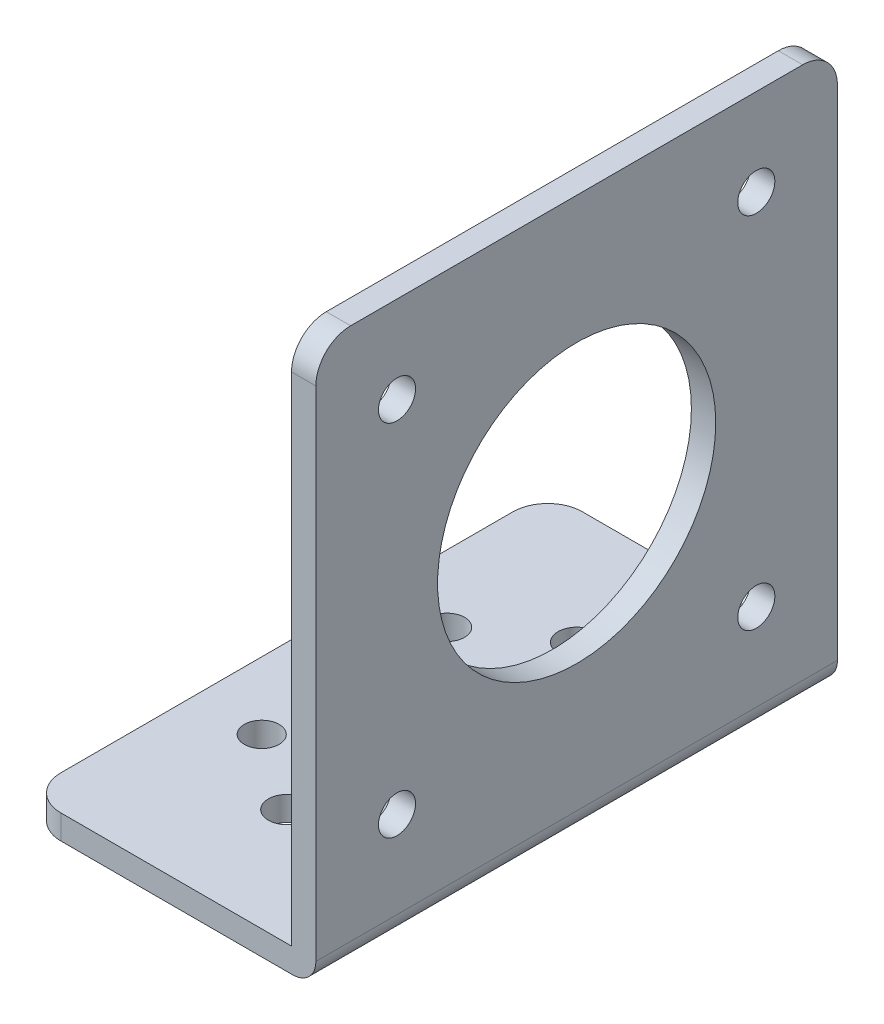
ISO-10303-21;
HEADER;
FILE_DESCRIPTION(('STEP AP214'),'2;1');
FILE_NAME('part.step','',(''),(''),'','','');
FILE_SCHEMA(('AUTOMOTIVE_DESIGN { 1 0 10303 214 1 1 1 1 }'));
ENDSEC;
DATA;
#1=APPLICATION_CONTEXT('core data for automotive mechanical design processes');
#2=APPLICATION_PROTOCOL_DEFINITION('international standard','automotive_design',2000,#1);
#3=PRODUCT_CONTEXT('',#1,'mechanical');
#4=PRODUCT('Part','Part','',(#3));
#5=PRODUCT_RELATED_PRODUCT_CATEGORY('part','',(#4));
#6=PRODUCT_DEFINITION_FORMATION('','',#4);
#7=PRODUCT_DEFINITION_CONTEXT('part definition',#1,'design');
#8=PRODUCT_DEFINITION('design','',#6,#7);
#9=PRODUCT_DEFINITION_SHAPE('','',#8);
#10=(LENGTH_UNIT() NAMED_UNIT(*) SI_UNIT(.MILLI.,.METRE.));
#11=(NAMED_UNIT(*) PLANE_ANGLE_UNIT() SI_UNIT($,.RADIAN.));
#12=(NAMED_UNIT(*) SI_UNIT($,.STERADIAN.) SOLID_ANGLE_UNIT());
#13=UNCERTAINTY_MEASURE_WITH_UNIT(LENGTH_MEASURE(1.E-05),#10,'distance_accuracy_value','');
#14=(GEOMETRIC_REPRESENTATION_CONTEXT(3) GLOBAL_UNCERTAINTY_ASSIGNED_CONTEXT((#13)) GLOBAL_UNIT_ASSIGNED_CONTEXT((#10,
#11,#12)) REPRESENTATION_CONTEXT('',''));
#15=CARTESIAN_POINT('',(0.,0.,0.));
#16=DIRECTION('',(0.,0.,1.));
#17=DIRECTION('',(1.,0.,0.));
#18=AXIS2_PLACEMENT_3D('',#15,#16,#17);
#19=CARTESIAN_POINT('',(0.,2.1,22.5));
#20=DIRECTION('',(0.,-1.,0.));
#21=DIRECTION('',(0.,0.,-1.));
#22=AXIS2_PLACEMENT_3D('',#19,#20,#21);
#23=PLANE('',#22);
#24=CARTESIAN_POINT('',(-2.10285259006358,2.1,7.96899861443036));
#25=DIRECTION('',(0.,1.,0.));
#26=DIRECTION('',(0.,0.,1.));
#27=AXIS2_PLACEMENT_3D('',#24,#25,#26);
#28=CIRCLE('',#27,1.49999999999999);
#29=CARTESIAN_POINT('',(-2.10285259006358,2.1,9.46899861443035));
#30=VERTEX_POINT('',#29);
#31=EDGE_CURVE('E504',#30,#30,#28,.T.);
#32=ORIENTED_EDGE('',*,*,#31,.F.);
#33=EDGE_LOOP('',(#32));
#34=FACE_BOUND('',#33,.T.);
#35=CARTESIAN_POINT('',(-17.1028525900636,2.1,-8.03100138556964));
#36=DIRECTION('',(0.,1.,0.));
#37=DIRECTION('',(0.,0.,1.));
#38=AXIS2_PLACEMENT_3D('',#35,#36,#37);
#39=CIRCLE('',#38,1.49999999999999);
#40=CARTESIAN_POINT('',(-17.1028525900636,2.1,-6.53100138556965));
#41=VERTEX_POINT('',#40);
#42=EDGE_CURVE('E496',#41,#41,#39,.T.);
#43=ORIENTED_EDGE('',*,*,#42,.F.);
#44=EDGE_LOOP('',(#43));
#45=FACE_BOUND('',#44,.T.);
#46=CARTESIAN_POINT('',(-17.1028525900636,2.1,7.96899861443036));
#47=DIRECTION('',(0.,1.,0.));
#48=DIRECTION('',(0.,0.,1.));
#49=AXIS2_PLACEMENT_3D('',#46,#47,#48);
#50=CIRCLE('',#49,1.49999999999999);
#51=CARTESIAN_POINT('',(-17.1028525900636,2.1,9.46899861443035));
#52=VERTEX_POINT('',#51);
#53=EDGE_CURVE('E488',#52,#52,#50,.T.);
#54=ORIENTED_EDGE('',*,*,#53,.F.);
#55=EDGE_LOOP('',(#54));
#56=FACE_BOUND('',#55,.T.);
#57=CARTESIAN_POINT('',(-2.10285259006358,2.1,-8.03100138556964));
#58=DIRECTION('',(0.,1.,0.));
#59=DIRECTION('',(0.,0.,1.));
#60=AXIS2_PLACEMENT_3D('',#57,#58,#59);
#61=CIRCLE('',#60,1.49999999999999);
#62=CARTESIAN_POINT('',(-2.10285259006358,2.1,-6.53100138556965));
#63=VERTEX_POINT('',#62);
#64=EDGE_CURVE('E480',#63,#63,#61,.T.);
#65=ORIENTED_EDGE('',*,*,#64,.F.);
#66=EDGE_LOOP('',(#65));
#67=FACE_BOUND('',#66,.T.);
#68=CARTESIAN_POINT('',(-10.4,2.1,-12.5));
#69=DIRECTION('',(0.,1.,0.));
#70=DIRECTION('',(0.,0.,1.));
#71=AXIS2_PLACEMENT_3D('',#68,#69,#70);
#72=CIRCLE('',#71,1.59999999999999);
#73=CARTESIAN_POINT('',(-10.4,2.1,-10.9));
#74=VERTEX_POINT('',#73);
#75=EDGE_CURVE('E472',#74,#74,#72,.T.);
#76=ORIENTED_EDGE('',*,*,#75,.F.);
#77=EDGE_LOOP('',(#76));
#78=FACE_BOUND('',#77,.T.);
#79=DIRECTION('',(0.,0.,-1.));
#80=VECTOR('',#79,1.);
#81=CARTESIAN_POINT('',(-22.9,2.1,22.5));
#82=LINE('',#81,#80);
#83=CARTESIAN_POINT('',(-22.9,2.1,19.5));
#84=VERTEX_POINT('',#83);
#85=CARTESIAN_POINT('',(-22.9,2.1,-19.5));
#86=VERTEX_POINT('',#85);
#87=EDGE_CURVE('E155',#84,#86,#82,.T.);
#88=ORIENTED_EDGE('',*,*,#87,.F.);
#89=CARTESIAN_POINT('',(-19.9,2.1,19.5));
#90=DIRECTION('',(0.,-1.,0.));
#91=DIRECTION('',(0.,0.,-1.));
#92=AXIS2_PLACEMENT_3D('',#89,#90,#91);
#93=CIRCLE('',#92,3.);
#94=CARTESIAN_POINT('',(-19.9,2.1,22.5));
#95=VERTEX_POINT('',#94);
#96=EDGE_CURVE('E161',#84,#95,#93,.F.);
#97=ORIENTED_EDGE('',*,*,#96,.T.);
#98=DIRECTION('',(-1.,0.,0.));
#99=VECTOR('',#98,1.);
#100=CARTESIAN_POINT('',(0.,2.1,22.5));
#101=LINE('',#100,#99);
#102=CARTESIAN_POINT('',(0.,2.1,22.5));
#103=VERTEX_POINT('',#102);
#104=EDGE_CURVE('E137',#103,#95,#101,.T.);
#105=ORIENTED_EDGE('',*,*,#104,.F.);
#106=DIRECTION('',(0.,0.,-1.));
#107=VECTOR('',#106,1.);
#108=CARTESIAN_POINT('',(0.,2.1,22.5));
#109=LINE('',#108,#107);
#110=CARTESIAN_POINT('',(0.,2.1,-22.5));
#111=VERTEX_POINT('',#110);
#112=EDGE_CURVE('E147',#103,#111,#109,.T.);
#113=ORIENTED_EDGE('',*,*,#112,.T.);
#114=DIRECTION('',(-1.,0.,0.));
#115=VECTOR('',#114,1.);
#116=CARTESIAN_POINT('',(0.,2.1,-22.5));
#117=LINE('',#116,#115);
#118=CARTESIAN_POINT('',(-19.9,2.1,-22.5));
#119=VERTEX_POINT('',#118);
#120=EDGE_CURVE('E144',#111,#119,#117,.T.);
#121=ORIENTED_EDGE('',*,*,#120,.T.);
#122=CARTESIAN_POINT('',(-19.9,2.1,-19.5));
#123=DIRECTION('',(0.,-1.,0.));
#124=DIRECTION('',(0.,0.,-1.));
#125=AXIS2_PLACEMENT_3D('',#122,#123,#124);
#126=CIRCLE('',#125,3.);
#127=EDGE_CURVE('E246',#119,#86,#126,.F.);
#128=ORIENTED_EDGE('',*,*,#127,.T.);
#129=EDGE_LOOP('',(#88,#97,#105,#113,#121,#128));
#130=FACE_BOUND('',#129,.T.);
#131=CARTESIAN_POINT('',(-10.4,2.1,12.5));
#132=DIRECTION('',(0.,1.,0.));
#133=DIRECTION('',(0.,0.,1.));
#134=AXIS2_PLACEMENT_3D('',#131,#132,#133);
#135=CIRCLE('',#134,1.59999999999999);
#136=CARTESIAN_POINT('',(-10.4,2.1,14.1));
#137=VERTEX_POINT('',#136);
#138=EDGE_CURVE('E464',#137,#137,#135,.T.);
#139=ORIENTED_EDGE('',*,*,#138,.F.);
#140=EDGE_LOOP('',(#139));
#141=FACE_BOUND('',#140,.T.);
#142=ADVANCED_FACE('F47',(#34,#45,#56,#67,#78,#130,#141),#23,.F.);
#143=CARTESIAN_POINT('',(-22.9,0.,-22.5));
#144=DIRECTION('',(0.,0.,-1.));
#145=DIRECTION('',(-1.,0.,0.));
#146=AXIS2_PLACEMENT_3D('',#143,#144,#145);
#147=PLANE('',#146);
#148=DIRECTION('',(1.,0.,0.));
#149=VECTOR('',#148,1.);
#150=CARTESIAN_POINT('',(-22.9,0.,-22.5));
#151=LINE('',#150,#149);
#152=CARTESIAN_POINT('',(-19.9,0.,-22.5));
#153=VERTEX_POINT('',#152);
#154=CARTESIAN_POINT('',(0.0999999999999994,0.,-22.5));
#155=VERTEX_POINT('',#154);
#156=EDGE_CURVE('E191',#153,#155,#151,.T.);
#157=ORIENTED_EDGE('',*,*,#156,.F.);
#158=DIRECTION('',(0.,1.,0.));
#159=VECTOR('',#158,1.);
#160=CARTESIAN_POINT('',(-19.9,2.1,-22.5));
#161=LINE('',#160,#159);
#162=EDGE_CURVE('E255',#153,#119,#161,.T.);
#163=ORIENTED_EDGE('',*,*,#162,.T.);
#164=ORIENTED_EDGE('',*,*,#120,.F.);
#165=DIRECTION('',(0.,-1.,0.));
#166=VECTOR('',#165,1.);
#167=CARTESIAN_POINT('',(0.,48.,-22.5));
#168=LINE('',#167,#166);
#169=CARTESIAN_POINT('',(0.,45.,-22.5));
#170=VERTEX_POINT('',#169);
#171=EDGE_CURVE('E150',#170,#111,#168,.T.);
#172=ORIENTED_EDGE('',*,*,#171,.F.);
#173=DIRECTION('',(1.,0.,0.));
#174=VECTOR('',#173,1.);
#175=CARTESIAN_POINT('',(-22.9,45.,-22.5));
#176=LINE('',#175,#174);
#177=CARTESIAN_POINT('',(2.1,45.,-22.5));
#178=VERTEX_POINT('',#177);
#179=EDGE_CURVE('E251',#170,#178,#176,.T.);
#180=ORIENTED_EDGE('',*,*,#179,.T.);
#181=DIRECTION('',(0.,1.,0.));
#182=VECTOR('',#181,1.);
#183=CARTESIAN_POINT('',(2.1,0.,-22.5));
#184=LINE('',#183,#182);
#185=CARTESIAN_POINT('',(2.1,2.,-22.5));
#186=VERTEX_POINT('',#185);
#187=EDGE_CURVE('E176',#186,#178,#184,.T.);
#188=ORIENTED_EDGE('',*,*,#187,.F.);
#189=CARTESIAN_POINT('',(0.0999999999999998,2.,-22.5));
#190=DIRECTION('',(0.,0.,-1.));
#191=DIRECTION('',(-1.,0.,0.));
#192=AXIS2_PLACEMENT_3D('',#189,#190,#191);
#193=CIRCLE('',#192,2.);
#194=EDGE_CURVE('E217',#186,#155,#193,.T.);
#195=ORIENTED_EDGE('',*,*,#194,.T.);
#196=EDGE_LOOP('',(#157,#163,#164,#172,#180,#188,#195));
#197=FACE_BOUND('',#196,.T.);
#198=ADVANCED_FACE('F276',(#197),#147,.T.);
#199=CARTESIAN_POINT('',(-22.9,0.,22.5));
#200=DIRECTION('',(0.,-1.,0.));
#201=DIRECTION('',(0.,0.,-1.));
#202=AXIS2_PLACEMENT_3D('',#199,#200,#201);
#203=PLANE('',#202);
#204=CARTESIAN_POINT('',(-2.10285259006358,0.,7.96899861443036));
#205=DIRECTION('',(0.,1.,0.));
#206=DIRECTION('',(0.,0.,1.));
#207=AXIS2_PLACEMENT_3D('',#204,#205,#206);
#208=CIRCLE('',#207,1.5);
#209=CARTESIAN_POINT('',(-2.10285259006358,0.,9.46899861443036));
#210=VERTEX_POINT('',#209);
#211=EDGE_CURVE('E500',#210,#210,#208,.T.);
#212=ORIENTED_EDGE('',*,*,#211,.T.);
#213=EDGE_LOOP('',(#212));
#214=FACE_BOUND('',#213,.T.);
#215=CARTESIAN_POINT('',(-17.1028525900636,0.,-8.03100138556964));
#216=DIRECTION('',(0.,1.,0.));
#217=DIRECTION('',(0.,0.,1.));
#218=AXIS2_PLACEMENT_3D('',#215,#216,#217);
#219=CIRCLE('',#218,1.5);
#220=CARTESIAN_POINT('',(-17.1028525900636,0.,-6.53100138556964));
#221=VERTEX_POINT('',#220);
#222=EDGE_CURVE('E492',#221,#221,#219,.T.);
#223=ORIENTED_EDGE('',*,*,#222,.T.);
#224=EDGE_LOOP('',(#223));
#225=FACE_BOUND('',#224,.T.);
#226=CARTESIAN_POINT('',(-17.1028525900636,0.,7.96899861443036));
#227=DIRECTION('',(0.,1.,0.));
#228=DIRECTION('',(0.,0.,1.));
#229=AXIS2_PLACEMENT_3D('',#226,#227,#228);
#230=CIRCLE('',#229,1.5);
#231=CARTESIAN_POINT('',(-17.1028525900636,0.,9.46899861443036));
#232=VERTEX_POINT('',#231);
#233=EDGE_CURVE('E484',#232,#232,#230,.T.);
#234=ORIENTED_EDGE('',*,*,#233,.T.);
#235=EDGE_LOOP('',(#234));
#236=FACE_BOUND('',#235,.T.);
#237=CARTESIAN_POINT('',(-2.10285259006358,0.,-8.03100138556964));
#238=DIRECTION('',(0.,1.,0.));
#239=DIRECTION('',(0.,0.,1.));
#240=AXIS2_PLACEMENT_3D('',#237,#238,#239);
#241=CIRCLE('',#240,1.5);
#242=CARTESIAN_POINT('',(-2.10285259006358,0.,-6.53100138556964));
#243=VERTEX_POINT('',#242);
#244=EDGE_CURVE('E476',#243,#243,#241,.T.);
#245=ORIENTED_EDGE('',*,*,#244,.T.);
#246=EDGE_LOOP('',(#245));
#247=FACE_BOUND('',#246,.T.);
#248=CARTESIAN_POINT('',(-10.4,0.,-12.5));
#249=DIRECTION('',(0.,1.,0.));
#250=DIRECTION('',(0.,0.,1.));
#251=AXIS2_PLACEMENT_3D('',#248,#249,#250);
#252=CIRCLE('',#251,1.59999999999999);
#253=CARTESIAN_POINT('',(-10.4,0.,-10.9));
#254=VERTEX_POINT('',#253);
#255=EDGE_CURVE('E468',#254,#254,#252,.T.);
#256=ORIENTED_EDGE('',*,*,#255,.T.);
#257=EDGE_LOOP('',(#256));
#258=FACE_BOUND('',#257,.T.);
#259=CARTESIAN_POINT('',(-10.4,0.,12.5));
#260=DIRECTION('',(0.,1.,0.));
#261=DIRECTION('',(0.,0.,1.));
#262=AXIS2_PLACEMENT_3D('',#259,#260,#261);
#263=CIRCLE('',#262,1.59999999999999);
#264=CARTESIAN_POINT('',(-10.4,0.,14.1));
#265=VERTEX_POINT('',#264);
#266=EDGE_CURVE('E460',#265,#265,#263,.T.);
#267=ORIENTED_EDGE('',*,*,#266,.T.);
#268=EDGE_LOOP('',(#267));
#269=FACE_BOUND('',#268,.T.);
#270=DIRECTION('',(1.,0.,0.));
#271=VECTOR('',#270,1.);
#272=CARTESIAN_POINT('',(-22.9,0.,22.5));
#273=LINE('',#272,#271);
#274=CARTESIAN_POINT('',(-19.9,0.,22.5));
#275=VERTEX_POINT('',#274);
#276=CARTESIAN_POINT('',(0.0999999999999994,0.,22.5));
#277=VERTEX_POINT('',#276);
#278=EDGE_CURVE('E182',#275,#277,#273,.T.);
#279=ORIENTED_EDGE('',*,*,#278,.F.);
#280=CARTESIAN_POINT('',(-19.9,0.,19.5));
#281=DIRECTION('',(0.,-1.,0.));
#282=DIRECTION('',(0.,0.,-1.));
#283=AXIS2_PLACEMENT_3D('',#280,#281,#282);
#284=CIRCLE('',#283,3.);
#285=CARTESIAN_POINT('',(-22.9,0.,19.5));
#286=VERTEX_POINT('',#285);
#287=EDGE_CURVE('E237',#275,#286,#284,.T.);
#288=ORIENTED_EDGE('',*,*,#287,.T.);
#289=DIRECTION('',(0.,0.,-1.));
#290=VECTOR('',#289,1.);
#291=CARTESIAN_POINT('',(-22.9,0.,22.5));
#292=LINE('',#291,#290);
#293=CARTESIAN_POINT('',(-22.9,0.,-19.5));
#294=VERTEX_POINT('',#293);
#295=EDGE_CURVE('E178',#286,#294,#292,.T.);
#296=ORIENTED_EDGE('',*,*,#295,.T.);
#297=CARTESIAN_POINT('',(-19.9,0.,-19.5));
#298=DIRECTION('',(0.,-1.,0.));
#299=DIRECTION('',(0.,0.,-1.));
#300=AXIS2_PLACEMENT_3D('',#297,#298,#299);
#301=CIRCLE('',#300,3.);
#302=EDGE_CURVE('E234',#294,#153,#301,.T.);
#303=ORIENTED_EDGE('',*,*,#302,.T.);
#304=ORIENTED_EDGE('',*,*,#156,.T.);
#305=DIRECTION('',(0.,0.,-1.));
#306=VECTOR('',#305,1.);
#307=CARTESIAN_POINT('',(0.0999999999999994,0.,22.5));
#308=LINE('',#307,#306);
#309=EDGE_CURVE('E221',#155,#277,#308,.F.);
#310=ORIENTED_EDGE('',*,*,#309,.T.);
#311=EDGE_LOOP('',(#279,#288,#296,#303,#304,#310));
#312=FACE_BOUND('',#311,.T.);
#313=ADVANCED_FACE('F301',(#214,#225,#236,#247,#258,#269,#312),#203,.T.);
#314=CARTESIAN_POINT('',(-22.9,48.,22.5));
#315=DIRECTION('',(0.,0.,1.));
#316=DIRECTION('',(1.,0.,0.));
#317=AXIS2_PLACEMENT_3D('',#314,#315,#316);
#318=PLANE('',#317);
#319=ORIENTED_EDGE('',*,*,#104,.T.);
#320=DIRECTION('',(0.,-1.,0.));
#321=VECTOR('',#320,1.);
#322=CARTESIAN_POINT('',(-19.9,0.,22.5));
#323=LINE('',#322,#321);
#324=EDGE_CURVE('E231',#95,#275,#323,.T.);
#325=ORIENTED_EDGE('',*,*,#324,.T.);
#326=ORIENTED_EDGE('',*,*,#278,.T.);
#327=CARTESIAN_POINT('',(0.0999999999999998,2.,22.5));
#328=DIRECTION('',(0.,0.,1.));
#329=DIRECTION('',(1.,0.,0.));
#330=AXIS2_PLACEMENT_3D('',#327,#328,#329);
#331=CIRCLE('',#330,2.);
#332=CARTESIAN_POINT('',(2.1,2.,22.5));
#333=VERTEX_POINT('',#332);
#334=EDGE_CURVE('E225',#277,#333,#331,.T.);
#335=ORIENTED_EDGE('',*,*,#334,.T.);
#336=DIRECTION('',(0.,-1.,0.));
#337=VECTOR('',#336,1.);
#338=CARTESIAN_POINT('',(2.1,48.,22.5));
#339=LINE('',#338,#337);
#340=CARTESIAN_POINT('',(2.1,45.,22.5));
#341=VERTEX_POINT('',#340);
#342=EDGE_CURVE('E183',#341,#333,#339,.T.);
#343=ORIENTED_EDGE('',*,*,#342,.F.);
#344=DIRECTION('',(1.,0.,0.));
#345=VECTOR('',#344,1.);
#346=CARTESIAN_POINT('',(-22.9,45.,22.5));
#347=LINE('',#346,#345);
#348=CARTESIAN_POINT('',(0.,45.,22.5));
#349=VERTEX_POINT('',#348);
#350=EDGE_CURVE('E140',#341,#349,#347,.F.);
#351=ORIENTED_EDGE('',*,*,#350,.T.);
#352=DIRECTION('',(0.,-1.,0.));
#353=VECTOR('',#352,1.);
#354=CARTESIAN_POINT('',(0.,48.,22.5));
#355=LINE('',#354,#353);
#356=EDGE_CURVE('E132',#349,#103,#355,.T.);
#357=ORIENTED_EDGE('',*,*,#356,.T.);
#358=EDGE_LOOP('',(#319,#325,#326,#335,#343,#351,#357));
#359=FACE_BOUND('',#358,.T.);
#360=ADVANCED_FACE('F134',(#359),#318,.T.);
#361=CARTESIAN_POINT('',(-22.9,48.,-22.5));
#362=DIRECTION('',(0.,1.,0.));
#363=DIRECTION('',(0.,0.,1.));
#364=AXIS2_PLACEMENT_3D('',#361,#362,#363);
#365=PLANE('',#364);
#366=DIRECTION('',(0.,0.,-1.));
#367=VECTOR('',#366,1.);
#368=CARTESIAN_POINT('',(0.,48.,22.5));
#369=LINE('',#368,#367);
#370=CARTESIAN_POINT('',(0.,48.,19.5));
#371=VERTEX_POINT('',#370);
#372=CARTESIAN_POINT('',(0.,48.,-19.5));
#373=VERTEX_POINT('',#372);
#374=EDGE_CURVE('E156',#371,#373,#369,.T.);
#375=ORIENTED_EDGE('',*,*,#374,.F.);
#376=DIRECTION('',(1.,0.,0.));
#377=VECTOR('',#376,1.);
#378=CARTESIAN_POINT('',(-22.9,48.,19.5));
#379=LINE('',#378,#377);
#380=CARTESIAN_POINT('',(2.1,48.,19.5));
#381=VERTEX_POINT('',#380);
#382=EDGE_CURVE('E262',#371,#381,#379,.T.);
#383=ORIENTED_EDGE('',*,*,#382,.T.);
#384=DIRECTION('',(0.,0.,1.));
#385=VECTOR('',#384,1.);
#386=CARTESIAN_POINT('',(2.1,48.,-22.5));
#387=LINE('',#386,#385);
#388=CARTESIAN_POINT('',(2.1,48.,-19.5));
#389=VERTEX_POINT('',#388);
#390=EDGE_CURVE('E186',#389,#381,#387,.T.);
#391=ORIENTED_EDGE('',*,*,#390,.F.);
#392=DIRECTION('',(1.,0.,0.));
#393=VECTOR('',#392,1.);
#394=CARTESIAN_POINT('',(-22.9,48.,-19.5));
#395=LINE('',#394,#393);
#396=EDGE_CURVE('E259',#389,#373,#395,.F.);
#397=ORIENTED_EDGE('',*,*,#396,.T.);
#398=EDGE_LOOP('',(#375,#383,#391,#397));
#399=FACE_BOUND('',#398,.T.);
#400=ADVANCED_FACE('F279',(#399),#365,.T.);
#401=CARTESIAN_POINT('',(-22.9,0.,0.));
#402=DIRECTION('',(1.,0.,0.));
#403=DIRECTION('',(0.,0.,-1.));
#404=AXIS2_PLACEMENT_3D('',#401,#402,#403);
#405=PLANE('',#404);
#406=ORIENTED_EDGE('',*,*,#295,.F.);
#407=DIRECTION('',(0.,-1.,0.));
#408=VECTOR('',#407,1.);
#409=CARTESIAN_POINT('',(-22.9,2.1,19.5));
#410=LINE('',#409,#408);
#411=EDGE_CURVE('E243',#286,#84,#410,.F.);
#412=ORIENTED_EDGE('',*,*,#411,.T.);
#413=ORIENTED_EDGE('',*,*,#87,.T.);
#414=DIRECTION('',(0.,1.,0.));
#415=VECTOR('',#414,1.);
#416=CARTESIAN_POINT('',(-22.9,0.,-19.5));
#417=LINE('',#416,#415);
#418=EDGE_CURVE('E240',#86,#294,#417,.F.);
#419=ORIENTED_EDGE('',*,*,#418,.T.);
#420=EDGE_LOOP('',(#406,#412,#413,#419));
#421=FACE_BOUND('',#420,.T.);
#422=ADVANCED_FACE('F312',(#421),#405,.F.);
#423=CARTESIAN_POINT('',(2.1,0.,0.));
#424=DIRECTION('',(1.,0.,0.));
#425=DIRECTION('',(0.,0.,-1.));
#426=AXIS2_PLACEMENT_3D('',#423,#424,#425);
#427=PLANE('',#426);
#428=CARTESIAN_POINT('',(2.1,9.5,-15.5));
#429=DIRECTION('',(1.,0.,0.));
#430=DIRECTION('',(0.,0.,-1.));
#431=AXIS2_PLACEMENT_3D('',#428,#429,#430);
#432=CIRCLE('',#431,1.59999999999999);
#433=CARTESIAN_POINT('',(2.1,9.5,-17.1));
#434=VERTEX_POINT('',#433);
#435=EDGE_CURVE('E213',#434,#434,#432,.T.);
#436=ORIENTED_EDGE('',*,*,#435,.F.);
#437=EDGE_LOOP('',(#436));
#438=FACE_BOUND('',#437,.T.);
#439=CARTESIAN_POINT('',(2.1,40.5,15.5));
#440=DIRECTION('',(1.,0.,0.));
#441=DIRECTION('',(0.,0.,-1.));
#442=AXIS2_PLACEMENT_3D('',#439,#440,#441);
#443=CIRCLE('',#442,1.59999999999999);
#444=CARTESIAN_POINT('',(2.1,40.5,13.9));
#445=VERTEX_POINT('',#444);
#446=EDGE_CURVE('E208',#445,#445,#443,.T.);
#447=ORIENTED_EDGE('',*,*,#446,.F.);
#448=EDGE_LOOP('',(#447));
#449=FACE_BOUND('',#448,.T.);
#450=CARTESIAN_POINT('',(2.1,40.5,-15.5));
#451=DIRECTION('',(1.,0.,0.));
#452=DIRECTION('',(0.,0.,-1.));
#453=AXIS2_PLACEMENT_3D('',#450,#451,#452);
#454=CIRCLE('',#453,1.59999999999999);
#455=CARTESIAN_POINT('',(2.1,40.5,-17.1));
#456=VERTEX_POINT('',#455);
#457=EDGE_CURVE('E207',#456,#456,#454,.T.);
#458=ORIENTED_EDGE('',*,*,#457,.F.);
#459=EDGE_LOOP('',(#458));
#460=FACE_BOUND('',#459,.T.);
#461=CARTESIAN_POINT('',(2.1,9.5,15.5));
#462=DIRECTION('',(1.,0.,0.));
#463=DIRECTION('',(0.,0.,-1.));
#464=AXIS2_PLACEMENT_3D('',#461,#462,#463);
#465=CIRCLE('',#464,1.59999999999999);
#466=CARTESIAN_POINT('',(2.1,9.5,13.9));
#467=VERTEX_POINT('',#466);
#468=EDGE_CURVE('E202',#467,#467,#465,.T.);
#469=ORIENTED_EDGE('',*,*,#468,.F.);
#470=EDGE_LOOP('',(#469));
#471=FACE_BOUND('',#470,.T.);
#472=CARTESIAN_POINT('',(2.1,25.,0.));
#473=DIRECTION('',(1.,0.,0.));
#474=DIRECTION('',(0.,0.,-1.));
#475=AXIS2_PLACEMENT_3D('',#472,#473,#474);
#476=CIRCLE('',#475,12.);
#477=CARTESIAN_POINT('',(2.1,25.,-12.));
#478=VERTEX_POINT('',#477);
#479=EDGE_CURVE('E201',#478,#478,#476,.T.);
#480=ORIENTED_EDGE('',*,*,#479,.F.);
#481=EDGE_LOOP('',(#480));
#482=FACE_BOUND('',#481,.T.);
#483=ORIENTED_EDGE('',*,*,#390,.T.);
#484=CARTESIAN_POINT('',(2.1,45.,19.5));
#485=DIRECTION('',(1.,0.,0.));
#486=DIRECTION('',(0.,0.,-1.));
#487=AXIS2_PLACEMENT_3D('',#484,#485,#486);
#488=CIRCLE('',#487,3.);
#489=EDGE_CURVE('E63',#381,#341,#488,.T.);
#490=ORIENTED_EDGE('',*,*,#489,.T.);
#491=ORIENTED_EDGE('',*,*,#342,.T.);
#492=DIRECTION('',(0.,0.,-1.));
#493=VECTOR('',#492,1.);
#494=CARTESIAN_POINT('',(2.1,2.,0.));
#495=LINE('',#494,#493);
#496=EDGE_CURVE('E194',#333,#186,#495,.T.);
#497=ORIENTED_EDGE('',*,*,#496,.T.);
#498=ORIENTED_EDGE('',*,*,#187,.T.);
#499=CARTESIAN_POINT('',(2.1,45.,-19.5));
#500=DIRECTION('',(1.,0.,0.));
#501=DIRECTION('',(0.,0.,-1.));
#502=AXIS2_PLACEMENT_3D('',#499,#500,#501);
#503=CIRCLE('',#502,3.);
#504=EDGE_CURVE('E71',#178,#389,#503,.T.);
#505=ORIENTED_EDGE('',*,*,#504,.T.);
#506=EDGE_LOOP('',(#483,#490,#491,#497,#498,#505));
#507=FACE_BOUND('',#506,.T.);
#508=ADVANCED_FACE('F280',(#438,#449,#460,#471,#482,#507),#427,.T.);
#509=CARTESIAN_POINT('',(0.,48.,22.5));
#510=DIRECTION('',(1.,0.,0.));
#511=DIRECTION('',(0.,0.,-1.));
#512=AXIS2_PLACEMENT_3D('',#509,#510,#511);
#513=PLANE('',#512);
#514=CARTESIAN_POINT('',(0.,9.5,-15.5));
#515=DIRECTION('',(1.,0.,0.));
#516=DIRECTION('',(0.,0.,-1.));
#517=AXIS2_PLACEMENT_3D('',#514,#515,#516);
#518=CIRCLE('',#517,1.59999999999999);
#519=CARTESIAN_POINT('',(0.,9.5,-17.1));
#520=VERTEX_POINT('',#519);
#521=EDGE_CURVE('E209',#520,#520,#518,.T.);
#522=ORIENTED_EDGE('',*,*,#521,.T.);
#523=EDGE_LOOP('',(#522));
#524=FACE_BOUND('',#523,.T.);
#525=CARTESIAN_POINT('',(0.,40.5,15.5));
#526=DIRECTION('',(1.,0.,0.));
#527=DIRECTION('',(0.,0.,-1.));
#528=AXIS2_PLACEMENT_3D('',#525,#526,#527);
#529=CIRCLE('',#528,1.59999999999999);
#530=CARTESIAN_POINT('',(0.,40.5,13.9));
#531=VERTEX_POINT('',#530);
#532=EDGE_CURVE('E203',#531,#531,#529,.T.);
#533=ORIENTED_EDGE('',*,*,#532,.T.);
#534=EDGE_LOOP('',(#533));
#535=FACE_BOUND('',#534,.T.);
#536=CARTESIAN_POINT('',(0.,40.5,-15.5));
#537=DIRECTION('',(1.,0.,0.));
#538=DIRECTION('',(0.,0.,-1.));
#539=AXIS2_PLACEMENT_3D('',#536,#537,#538);
#540=CIRCLE('',#539,1.59999999999999);
#541=CARTESIAN_POINT('',(0.,40.5,-17.1));
#542=VERTEX_POINT('',#541);
#543=EDGE_CURVE('E447',#542,#542,#540,.T.);
#544=ORIENTED_EDGE('',*,*,#543,.T.);
#545=EDGE_LOOP('',(#544));
#546=FACE_BOUND('',#545,.T.);
#547=CARTESIAN_POINT('',(0.,9.5,15.5));
#548=DIRECTION('',(1.,0.,0.));
#549=DIRECTION('',(0.,0.,-1.));
#550=AXIS2_PLACEMENT_3D('',#547,#548,#549);
#551=CIRCLE('',#550,1.59999999999999);
#552=CARTESIAN_POINT('',(0.,9.5,13.9));
#553=VERTEX_POINT('',#552);
#554=EDGE_CURVE('E197',#553,#553,#551,.T.);
#555=ORIENTED_EDGE('',*,*,#554,.T.);
#556=EDGE_LOOP('',(#555));
#557=FACE_BOUND('',#556,.T.);
#558=CARTESIAN_POINT('',(0.,25.,0.));
#559=DIRECTION('',(1.,0.,0.));
#560=DIRECTION('',(0.,0.,-1.));
#561=AXIS2_PLACEMENT_3D('',#558,#559,#560);
#562=CIRCLE('',#561,12.);
#563=CARTESIAN_POINT('',(0.,25.,-12.));
#564=VERTEX_POINT('',#563);
#565=EDGE_CURVE('E171',#564,#564,#562,.T.);
#566=ORIENTED_EDGE('',*,*,#565,.T.);
#567=EDGE_LOOP('',(#566));
#568=FACE_BOUND('',#567,.T.);
#569=ORIENTED_EDGE('',*,*,#356,.F.);
#570=CARTESIAN_POINT('',(0.,45.,19.5));
#571=DIRECTION('',(1.,0.,0.));
#572=DIRECTION('',(0.,0.,-1.));
#573=AXIS2_PLACEMENT_3D('',#570,#571,#572);
#574=CIRCLE('',#573,3.);
#575=EDGE_CURVE('E11',#349,#371,#574,.F.);
#576=ORIENTED_EDGE('',*,*,#575,.T.);
#577=ORIENTED_EDGE('',*,*,#374,.T.);
#578=CARTESIAN_POINT('',(0.,45.,-19.5));
#579=DIRECTION('',(1.,0.,0.));
#580=DIRECTION('',(0.,0.,-1.));
#581=AXIS2_PLACEMENT_3D('',#578,#579,#580);
#582=CIRCLE('',#581,3.);
#583=EDGE_CURVE('E56',#373,#170,#582,.F.);
#584=ORIENTED_EDGE('',*,*,#583,.T.);
#585=ORIENTED_EDGE('',*,*,#171,.T.);
#586=ORIENTED_EDGE('',*,*,#112,.F.);
#587=EDGE_LOOP('',(#569,#576,#577,#584,#585,#586));
#588=FACE_BOUND('',#587,.T.);
#589=ADVANCED_FACE('F148',(#524,#535,#546,#557,#568,#588),#513,.F.);
#590=CARTESIAN_POINT('',(2.1,25.,0.));
#591=DIRECTION('',(1.,0.,0.));
#592=DIRECTION('',(0.,0.,-1.));
#593=AXIS2_PLACEMENT_3D('',#590,#591,#592);
#594=CYLINDRICAL_SURFACE('',#593,12.);
#595=ORIENTED_EDGE('',*,*,#479,.T.);
#596=EDGE_LOOP('',(#595));
#597=FACE_BOUND('',#596,.T.);
#598=ORIENTED_EDGE('',*,*,#565,.F.);
#599=EDGE_LOOP('',(#598));
#600=FACE_BOUND('',#599,.T.);
#601=ADVANCED_FACE('F307',(#597,#600),#594,.F.);
#602=CARTESIAN_POINT('',(2.1,9.5,15.5));
#603=DIRECTION('',(1.,0.,0.));
#604=DIRECTION('',(0.,0.,-1.));
#605=AXIS2_PLACEMENT_3D('',#602,#603,#604);
#606=CYLINDRICAL_SURFACE('',#605,1.59999999999999);
#607=ORIENTED_EDGE('',*,*,#468,.T.);
#608=EDGE_LOOP('',(#607));
#609=FACE_BOUND('',#608,.T.);
#610=ORIENTED_EDGE('',*,*,#554,.F.);
#611=EDGE_LOOP('',(#610));
#612=FACE_BOUND('',#611,.T.);
#613=ADVANCED_FACE('F423',(#609,#612),#606,.F.);
#614=CARTESIAN_POINT('',(2.1,40.5,-15.5));
#615=DIRECTION('',(1.,0.,0.));
#616=DIRECTION('',(0.,0.,-1.));
#617=AXIS2_PLACEMENT_3D('',#614,#615,#616);
#618=CYLINDRICAL_SURFACE('',#617,1.59999999999999);
#619=ORIENTED_EDGE('',*,*,#457,.T.);
#620=EDGE_LOOP('',(#619));
#621=FACE_BOUND('',#620,.T.);
#622=ORIENTED_EDGE('',*,*,#543,.F.);
#623=EDGE_LOOP('',(#622));
#624=FACE_BOUND('',#623,.T.);
#625=ADVANCED_FACE('F420',(#621,#624),#618,.F.);
#626=CARTESIAN_POINT('',(2.1,40.5,15.5));
#627=DIRECTION('',(1.,0.,0.));
#628=DIRECTION('',(0.,0.,-1.));
#629=AXIS2_PLACEMENT_3D('',#626,#627,#628);
#630=CYLINDRICAL_SURFACE('',#629,1.59999999999999);
#631=ORIENTED_EDGE('',*,*,#446,.T.);
#632=EDGE_LOOP('',(#631));
#633=FACE_BOUND('',#632,.T.);
#634=ORIENTED_EDGE('',*,*,#532,.F.);
#635=EDGE_LOOP('',(#634));
#636=FACE_BOUND('',#635,.T.);
#637=ADVANCED_FACE('F416',(#633,#636),#630,.F.);
#638=CARTESIAN_POINT('',(2.1,9.5,-15.5));
#639=DIRECTION('',(1.,0.,0.));
#640=DIRECTION('',(0.,0.,-1.));
#641=AXIS2_PLACEMENT_3D('',#638,#639,#640);
#642=CYLINDRICAL_SURFACE('',#641,1.59999999999999);
#643=ORIENTED_EDGE('',*,*,#435,.T.);
#644=EDGE_LOOP('',(#643));
#645=FACE_BOUND('',#644,.T.);
#646=ORIENTED_EDGE('',*,*,#521,.F.);
#647=EDGE_LOOP('',(#646));
#648=FACE_BOUND('',#647,.T.);
#649=ADVANCED_FACE('F412',(#645,#648),#642,.F.);
#650=CARTESIAN_POINT('',(-10.4,2.1,12.5));
#651=DIRECTION('',(0.,1.,0.));
#652=DIRECTION('',(0.,0.,1.));
#653=AXIS2_PLACEMENT_3D('',#650,#651,#652);
#654=CYLINDRICAL_SURFACE('',#653,1.59999999999999);
#655=ORIENTED_EDGE('',*,*,#266,.F.);
#656=EDGE_LOOP('',(#655));
#657=FACE_BOUND('',#656,.T.);
#658=ORIENTED_EDGE('',*,*,#138,.T.);
#659=EDGE_LOOP('',(#658));
#660=FACE_BOUND('',#659,.T.);
#661=ADVANCED_FACE('F408',(#657,#660),#654,.F.);
#662=CARTESIAN_POINT('',(-10.4,2.1,-12.5));
#663=DIRECTION('',(0.,1.,0.));
#664=DIRECTION('',(0.,0.,1.));
#665=AXIS2_PLACEMENT_3D('',#662,#663,#664);
#666=CYLINDRICAL_SURFACE('',#665,1.59999999999999);
#667=ORIENTED_EDGE('',*,*,#255,.F.);
#668=EDGE_LOOP('',(#667));
#669=FACE_BOUND('',#668,.T.);
#670=ORIENTED_EDGE('',*,*,#75,.T.);
#671=EDGE_LOOP('',(#670));
#672=FACE_BOUND('',#671,.T.);
#673=ADVANCED_FACE('F328',(#669,#672),#666,.F.);
#674=CARTESIAN_POINT('',(0.0999999999999998,2.,0.));
#675=DIRECTION('',(0.,0.,-1.));
#676=DIRECTION('',(-1.,0.,0.));
#677=AXIS2_PLACEMENT_3D('',#674,#675,#676);
#678=CYLINDRICAL_SURFACE('',#677,2.);
#679=ORIENTED_EDGE('',*,*,#334,.F.);
#680=ORIENTED_EDGE('',*,*,#309,.F.);
#681=ORIENTED_EDGE('',*,*,#194,.F.);
#682=ORIENTED_EDGE('',*,*,#496,.F.);
#683=EDGE_LOOP('',(#679,#680,#681,#682));
#684=FACE_BOUND('',#683,.T.);
#685=ADVANCED_FACE('F325',(#684),#678,.T.);
#686=CARTESIAN_POINT('',(-19.9,48.,19.5));
#687=DIRECTION('',(0.,1.,0.));
#688=DIRECTION('',(0.,0.,1.));
#689=AXIS2_PLACEMENT_3D('',#686,#687,#688);
#690=CYLINDRICAL_SURFACE('',#689,3.);
#691=ORIENTED_EDGE('',*,*,#96,.F.);
#692=ORIENTED_EDGE('',*,*,#411,.F.);
#693=ORIENTED_EDGE('',*,*,#287,.F.);
#694=ORIENTED_EDGE('',*,*,#324,.F.);
#695=EDGE_LOOP('',(#691,#692,#693,#694));
#696=FACE_BOUND('',#695,.T.);
#697=ADVANCED_FACE('F291',(#696),#690,.T.);
#698=CARTESIAN_POINT('',(-19.9,0.,-19.5));
#699=DIRECTION('',(0.,-1.,0.));
#700=DIRECTION('',(0.,0.,-1.));
#701=AXIS2_PLACEMENT_3D('',#698,#699,#700);
#702=CYLINDRICAL_SURFACE('',#701,3.);
#703=ORIENTED_EDGE('',*,*,#302,.F.);
#704=ORIENTED_EDGE('',*,*,#418,.F.);
#705=ORIENTED_EDGE('',*,*,#127,.F.);
#706=ORIENTED_EDGE('',*,*,#162,.F.);
#707=EDGE_LOOP('',(#703,#704,#705,#706));
#708=FACE_BOUND('',#707,.T.);
#709=ADVANCED_FACE('F285',(#708),#702,.T.);
#710=CARTESIAN_POINT('',(-22.9,45.,19.5));
#711=DIRECTION('',(1.,0.,0.));
#712=DIRECTION('',(0.,0.,-1.));
#713=AXIS2_PLACEMENT_3D('',#710,#711,#712);
#714=CYLINDRICAL_SURFACE('',#713,3.);
#715=ORIENTED_EDGE('',*,*,#575,.F.);
#716=ORIENTED_EDGE('',*,*,#350,.F.);
#717=ORIENTED_EDGE('',*,*,#489,.F.);
#718=ORIENTED_EDGE('',*,*,#382,.F.);
#719=EDGE_LOOP('',(#715,#716,#717,#718));
#720=FACE_BOUND('',#719,.T.);
#721=ADVANCED_FACE('F283',(#720),#714,.T.);
#722=CARTESIAN_POINT('',(-22.9,45.,-19.5));
#723=DIRECTION('',(1.,0.,0.));
#724=DIRECTION('',(0.,0.,-1.));
#725=AXIS2_PLACEMENT_3D('',#722,#723,#724);
#726=CYLINDRICAL_SURFACE('',#725,3.);
#727=ORIENTED_EDGE('',*,*,#583,.F.);
#728=ORIENTED_EDGE('',*,*,#396,.F.);
#729=ORIENTED_EDGE('',*,*,#504,.F.);
#730=ORIENTED_EDGE('',*,*,#179,.F.);
#731=EDGE_LOOP('',(#727,#728,#729,#730));
#732=FACE_BOUND('',#731,.T.);
#733=ADVANCED_FACE('F49',(#732),#726,.T.);
#734=CARTESIAN_POINT('',(-2.10285259006358,2.1,-8.03100138556964));
#735=DIRECTION('',(0.,1.,0.));
#736=DIRECTION('',(0.,0.,1.));
#737=AXIS2_PLACEMENT_3D('',#734,#735,#736);
#738=CYLINDRICAL_SURFACE('',#737,1.49999999999999);
#739=ORIENTED_EDGE('',*,*,#244,.F.);
#740=EDGE_LOOP('',(#739));
#741=FACE_BOUND('',#740,.T.);
#742=ORIENTED_EDGE('',*,*,#64,.T.);
#743=EDGE_LOOP('',(#742));
#744=FACE_BOUND('',#743,.T.);
#745=ADVANCED_FACE('F290',(#741,#744),#738,.F.);
#746=CARTESIAN_POINT('',(-17.1028525900636,2.1,7.96899861443036));
#747=DIRECTION('',(0.,1.,0.));
#748=DIRECTION('',(0.,0.,1.));
#749=AXIS2_PLACEMENT_3D('',#746,#747,#748);
#750=CYLINDRICAL_SURFACE('',#749,1.49999999999999);
#751=ORIENTED_EDGE('',*,*,#233,.F.);
#752=EDGE_LOOP('',(#751));
#753=FACE_BOUND('',#752,.T.);
#754=ORIENTED_EDGE('',*,*,#53,.T.);
#755=EDGE_LOOP('',(#754));
#756=FACE_BOUND('',#755,.T.);
#757=ADVANCED_FACE('F370',(#753,#756),#750,.F.);
#758=CARTESIAN_POINT('',(-17.1028525900636,2.1,-8.03100138556964));
#759=DIRECTION('',(0.,1.,0.));
#760=DIRECTION('',(0.,0.,1.));
#761=AXIS2_PLACEMENT_3D('',#758,#759,#760);
#762=CYLINDRICAL_SURFACE('',#761,1.49999999999999);
#763=ORIENTED_EDGE('',*,*,#222,.F.);
#764=EDGE_LOOP('',(#763));
#765=FACE_BOUND('',#764,.T.);
#766=ORIENTED_EDGE('',*,*,#42,.T.);
#767=EDGE_LOOP('',(#766));
#768=FACE_BOUND('',#767,.T.);
#769=ADVANCED_FACE('F380',(#765,#768),#762,.F.);
#770=CARTESIAN_POINT('',(-2.10285259006358,2.1,7.96899861443036));
#771=DIRECTION('',(0.,1.,0.));
#772=DIRECTION('',(0.,0.,1.));
#773=AXIS2_PLACEMENT_3D('',#770,#771,#772);
#774=CYLINDRICAL_SURFACE('',#773,1.49999999999999);
#775=ORIENTED_EDGE('',*,*,#211,.F.);
#776=EDGE_LOOP('',(#775));
#777=FACE_BOUND('',#776,.T.);
#778=ORIENTED_EDGE('',*,*,#31,.T.);
#779=EDGE_LOOP('',(#778));
#780=FACE_BOUND('',#779,.T.);
#781=ADVANCED_FACE('F390',(#777,#780),#774,.F.);
#782=CLOSED_SHELL('',(#142,#198,#313,#360,#400,#422,#508,#589,#601,#613,#625,#637,#649,#661,
#673,#685,#697,#709,#721,#733,#745,#757,#769,#781));
#783=MANIFOLD_SOLID_BREP('B2',#782);
#784=ADVANCED_BREP_SHAPE_REPRESENTATION('',(#18,#783),#14);
#785=SHAPE_DEFINITION_REPRESENTATION(#9,#784);
ENDSEC;
END-ISO-10303-21;
